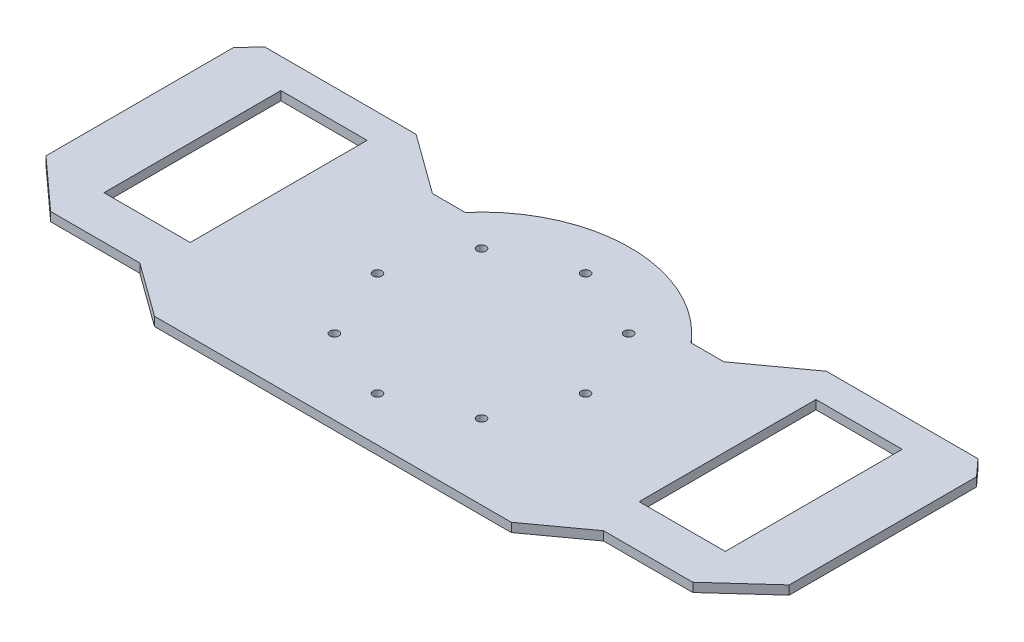
ISO-10303-21;
HEADER;
FILE_DESCRIPTION(('STEP AP214'),'2;1');
FILE_NAME('part.step','',(''),(''),'','','');
FILE_SCHEMA(('AUTOMOTIVE_DESIGN { 1 0 10303 214 1 1 1 1 }'));
ENDSEC;
DATA;
#1=APPLICATION_CONTEXT('core data for automotive mechanical design processes');
#2=APPLICATION_PROTOCOL_DEFINITION('international standard','automotive_design',2000,#1);
#3=PRODUCT_CONTEXT('',#1,'mechanical');
#4=PRODUCT('Part','Part','',(#3));
#5=PRODUCT_RELATED_PRODUCT_CATEGORY('part','',(#4));
#6=PRODUCT_DEFINITION_FORMATION('','',#4);
#7=PRODUCT_DEFINITION_CONTEXT('part definition',#1,'design');
#8=PRODUCT_DEFINITION('design','',#6,#7);
#9=PRODUCT_DEFINITION_SHAPE('','',#8);
#10=(LENGTH_UNIT() NAMED_UNIT(*) SI_UNIT(.MILLI.,.METRE.));
#11=(NAMED_UNIT(*) PLANE_ANGLE_UNIT() SI_UNIT($,.RADIAN.));
#12=(NAMED_UNIT(*) SI_UNIT($,.STERADIAN.) SOLID_ANGLE_UNIT());
#13=UNCERTAINTY_MEASURE_WITH_UNIT(LENGTH_MEASURE(1.E-05),#10,'distance_accuracy_value','');
#14=(GEOMETRIC_REPRESENTATION_CONTEXT(3) GLOBAL_UNCERTAINTY_ASSIGNED_CONTEXT((#13)) GLOBAL_UNIT_ASSIGNED_CONTEXT((#10,
#11,#12)) REPRESENTATION_CONTEXT('',''));
#15=CARTESIAN_POINT('',(0.,0.,0.));
#16=DIRECTION('',(0.,0.,1.));
#17=DIRECTION('',(1.,0.,0.));
#18=AXIS2_PLACEMENT_3D('',#15,#16,#17);
#19=CARTESIAN_POINT('',(0.,3.,-4.99999999999999));
#20=DIRECTION('',(0.,1.,0.));
#21=DIRECTION('',(0.,0.,1.));
#22=AXIS2_PLACEMENT_3D('',#19,#20,#21);
#23=PLANE('',#22);
#24=CARTESIAN_POINT('',(-3.66894015169095E-13,3.,-40.));
#25=DIRECTION('',(0.,1.,0.));
#26=DIRECTION('',(0.,0.,1.));
#27=AXIS2_PLACEMENT_3D('',#24,#25,#26);
#28=CIRCLE('',#27,1.50000000000001);
#29=CARTESIAN_POINT('',(-3.66894015169095E-13,3.,-38.5));
#30=VERTEX_POINT('',#29);
#31=EDGE_CURVE('E824',#30,#30,#28,.T.);
#32=ORIENTED_EDGE('',*,*,#31,.F.);
#33=EDGE_LOOP('',(#32));
#34=FACE_BOUND('',#33,.T.);
#35=CARTESIAN_POINT('',(35.,3.,-5.00000000000024));
#36=DIRECTION('',(0.,1.,0.));
#37=DIRECTION('',(0.,0.,1.));
#38=AXIS2_PLACEMENT_3D('',#35,#36,#37);
#39=CIRCLE('',#38,1.50000000000001);
#40=CARTESIAN_POINT('',(35.,3.,-3.50000000000023));
#41=VERTEX_POINT('',#40);
#42=EDGE_CURVE('E836',#41,#41,#39,.T.);
#43=ORIENTED_EDGE('',*,*,#42,.F.);
#44=EDGE_LOOP('',(#43));
#45=FACE_BOUND('',#44,.T.);
#46=CARTESIAN_POINT('',(1.22298005056365E-13,3.,30.));
#47=DIRECTION('',(0.,1.,0.));
#48=DIRECTION('',(0.,0.,1.));
#49=AXIS2_PLACEMENT_3D('',#46,#47,#48);
#50=CIRCLE('',#49,1.50000000000001);
#51=CARTESIAN_POINT('',(1.22298005056365E-13,3.,31.5));
#52=VERTEX_POINT('',#51);
#53=EDGE_CURVE('E848',#52,#52,#50,.T.);
#54=ORIENTED_EDGE('',*,*,#53,.F.);
#55=EDGE_LOOP('',(#54));
#56=FACE_BOUND('',#55,.T.);
#57=DIRECTION('',(1.,0.,0.));
#58=VECTOR('',#57,1.);
#59=CARTESIAN_POINT('',(-104.5,3.,17.5));
#60=LINE('',#59,#58);
#61=CARTESIAN_POINT('',(-104.5,3.,17.5));
#62=VERTEX_POINT('',#61);
#63=CARTESIAN_POINT('',(-75.5,3.,17.5));
#64=VERTEX_POINT('',#63);
#65=EDGE_CURVE('E214',#62,#64,#60,.T.);
#66=ORIENTED_EDGE('',*,*,#65,.F.);
#67=DIRECTION('',(0.,0.,1.));
#68=VECTOR('',#67,1.);
#69=CARTESIAN_POINT('',(-104.5,3.,-42.));
#70=LINE('',#69,#68);
#71=CARTESIAN_POINT('',(-104.5,3.,-42.));
#72=VERTEX_POINT('',#71);
#73=EDGE_CURVE('E206',#72,#62,#70,.T.);
#74=ORIENTED_EDGE('',*,*,#73,.F.);
#75=DIRECTION('',(-1.,0.,0.));
#76=VECTOR('',#75,1.);
#77=CARTESIAN_POINT('',(-104.5,3.,-42.));
#78=LINE('',#77,#76);
#79=CARTESIAN_POINT('',(-75.5,3.,-42.));
#80=VERTEX_POINT('',#79);
#81=EDGE_CURVE('E229',#80,#72,#78,.T.);
#82=ORIENTED_EDGE('',*,*,#81,.F.);
#83=DIRECTION('',(0.,0.,-1.));
#84=VECTOR('',#83,1.);
#85=CARTESIAN_POINT('',(-75.5,3.,-42.));
#86=LINE('',#85,#84);
#87=EDGE_CURVE('E227',#64,#80,#86,.T.);
#88=ORIENTED_EDGE('',*,*,#87,.F.);
#89=EDGE_LOOP('',(#66,#74,#82,#88));
#90=FACE_BOUND('',#89,.T.);
#91=DIRECTION('',(1.,0.,0.));
#92=VECTOR('',#91,1.);
#93=CARTESIAN_POINT('',(75.5,3.,17.5));
#94=LINE('',#93,#92);
#95=CARTESIAN_POINT('',(75.5,3.,17.5));
#96=VERTEX_POINT('',#95);
#97=CARTESIAN_POINT('',(104.5,3.,17.5));
#98=VERTEX_POINT('',#97);
#99=EDGE_CURVE('E247',#96,#98,#94,.T.);
#100=ORIENTED_EDGE('',*,*,#99,.F.);
#101=DIRECTION('',(0.,0.,1.));
#102=VECTOR('',#101,1.);
#103=CARTESIAN_POINT('',(75.5,3.,-42.));
#104=LINE('',#103,#102);
#105=CARTESIAN_POINT('',(75.5,3.,-42.));
#106=VERTEX_POINT('',#105);
#107=EDGE_CURVE('E245',#106,#96,#104,.T.);
#108=ORIENTED_EDGE('',*,*,#107,.F.);
#109=DIRECTION('',(-1.,0.,0.));
#110=VECTOR('',#109,1.);
#111=CARTESIAN_POINT('',(75.5,3.,-42.));
#112=LINE('',#111,#110);
#113=CARTESIAN_POINT('',(104.5,3.,-42.));
#114=VERTEX_POINT('',#113);
#115=EDGE_CURVE('E253',#114,#106,#112,.T.);
#116=ORIENTED_EDGE('',*,*,#115,.F.);
#117=DIRECTION('',(0.,0.,-1.));
#118=VECTOR('',#117,1.);
#119=CARTESIAN_POINT('',(104.5,3.,-42.));
#120=LINE('',#119,#118);
#121=EDGE_CURVE('E250',#98,#114,#120,.T.);
#122=ORIENTED_EDGE('',*,*,#121,.F.);
#123=EDGE_LOOP('',(#100,#108,#116,#122));
#124=FACE_BOUND('',#123,.T.);
#125=CARTESIAN_POINT('',(-35.,3.,-4.99999999999999));
#126=DIRECTION('',(0.,1.,0.));
#127=DIRECTION('',(0.,0.,1.));
#128=AXIS2_PLACEMENT_3D('',#125,#126,#127);
#129=CIRCLE('',#128,1.5);
#130=CARTESIAN_POINT('',(-35.,3.,-3.49999999999999));
#131=VERTEX_POINT('',#130);
#132=EDGE_CURVE('E276',#131,#131,#129,.T.);
#133=ORIENTED_EDGE('',*,*,#132,.F.);
#134=EDGE_LOOP('',(#133));
#135=FACE_BOUND('',#134,.T.);
#136=DIRECTION('',(-0.809536451060492,0.,-0.587069616318528));
#137=VECTOR('',#136,1.);
#138=CARTESIAN_POINT('',(-69.,3.,-52.));
#139=LINE('',#138,#137);
#140=CARTESIAN_POINT('',(-49.,3.,-37.4961536185439));
#141=VERTEX_POINT('',#140);
#142=CARTESIAN_POINT('',(-69.,3.,-52.));
#143=VERTEX_POINT('',#142);
#144=EDGE_CURVE('E282',#141,#143,#139,.T.);
#145=ORIENTED_EDGE('',*,*,#144,.T.);
#146=DIRECTION('',(-1.,0.,0.));
#147=VECTOR('',#146,1.);
#148=CARTESIAN_POINT('',(-120.,3.,-52.));
#149=LINE('',#148,#147);
#150=CARTESIAN_POINT('',(-120.,3.,-52.));
#151=VERTEX_POINT('',#150);
#152=EDGE_CURVE('E285',#143,#151,#149,.T.);
#153=ORIENTED_EDGE('',*,*,#152,.T.);
#154=DIRECTION('',(-0.672376251725183,0.,0.740209548787364));
#155=VECTOR('',#154,1.);
#156=CARTESIAN_POINT('',(-125.,3.,-46.4955703976149));
#157=LINE('',#156,#155);
#158=CARTESIAN_POINT('',(-125.,3.,-46.4955703976149));
#159=VERTEX_POINT('',#158);
#160=EDGE_CURVE('E288',#151,#159,#157,.T.);
#161=ORIENTED_EDGE('',*,*,#160,.T.);
#162=DIRECTION('',(0.,0.,1.));
#163=VECTOR('',#162,1.);
#164=CARTESIAN_POINT('',(-125.,3.,16.5044296023851));
#165=LINE('',#164,#163);
#166=CARTESIAN_POINT('',(-125.,3.,16.5044296023851));
#167=VERTEX_POINT('',#166);
#168=EDGE_CURVE('E290',#159,#167,#165,.T.);
#169=ORIENTED_EDGE('',*,*,#168,.T.);
#170=DIRECTION('',(0.740209548787364,0.,0.672376251725183));
#171=VECTOR('',#170,1.);
#172=CARTESIAN_POINT('',(-108.,3.,31.9465382566895));
#173=LINE('',#172,#171);
#174=CARTESIAN_POINT('',(-108.,3.,31.9465382566895));
#175=VERTEX_POINT('',#174);
#176=EDGE_CURVE('E292',#167,#175,#173,.T.);
#177=ORIENTED_EDGE('',*,*,#176,.T.);
#178=DIRECTION('',(1.,0.,0.));
#179=VECTOR('',#178,1.);
#180=CARTESIAN_POINT('',(-78.,3.,31.9465382566895));
#181=LINE('',#180,#179);
#182=CARTESIAN_POINT('',(-78.,3.,31.9465382566895));
#183=VERTEX_POINT('',#182);
#184=EDGE_CURVE('E294',#175,#183,#181,.T.);
#185=ORIENTED_EDGE('',*,*,#184,.T.);
#186=DIRECTION('',(0.809536451060491,0.,0.587069616318529));
#187=VECTOR('',#186,1.);
#188=CARTESIAN_POINT('',(-60.,3.,45.));
#189=LINE('',#188,#187);
#190=CARTESIAN_POINT('',(-60.,3.,45.));
#191=VERTEX_POINT('',#190);
#192=EDGE_CURVE('E296',#183,#191,#189,.T.);
#193=ORIENTED_EDGE('',*,*,#192,.T.);
#194=DIRECTION('',(1.,0.,0.));
#195=VECTOR('',#194,1.);
#196=CARTESIAN_POINT('',(60.,3.,45.));
#197=LINE('',#196,#195);
#198=CARTESIAN_POINT('',(60.,3.,45.));
#199=VERTEX_POINT('',#198);
#200=EDGE_CURVE('E298',#191,#199,#197,.T.);
#201=ORIENTED_EDGE('',*,*,#200,.T.);
#202=DIRECTION('',(0.809536451060491,0.,-0.587069616318529));
#203=VECTOR('',#202,1.);
#204=CARTESIAN_POINT('',(78.,3.,31.9465382566895));
#205=LINE('',#204,#203);
#206=CARTESIAN_POINT('',(78.,3.,31.9465382566895));
#207=VERTEX_POINT('',#206);
#208=EDGE_CURVE('E300',#199,#207,#205,.T.);
#209=ORIENTED_EDGE('',*,*,#208,.T.);
#210=DIRECTION('',(1.,0.,0.));
#211=VECTOR('',#210,1.);
#212=CARTESIAN_POINT('',(108.,3.,31.9465382566895));
#213=LINE('',#212,#211);
#214=CARTESIAN_POINT('',(108.,3.,31.9465382566895));
#215=VERTEX_POINT('',#214);
#216=EDGE_CURVE('E302',#207,#215,#213,.T.);
#217=ORIENTED_EDGE('',*,*,#216,.T.);
#218=DIRECTION('',(0.740209548787364,0.,-0.672376251725183));
#219=VECTOR('',#218,1.);
#220=CARTESIAN_POINT('',(125.,3.,16.5044296023851));
#221=LINE('',#220,#219);
#222=CARTESIAN_POINT('',(125.,3.,16.5044296023851));
#223=VERTEX_POINT('',#222);
#224=EDGE_CURVE('E304',#215,#223,#221,.T.);
#225=ORIENTED_EDGE('',*,*,#224,.T.);
#226=DIRECTION('',(0.,0.,-1.));
#227=VECTOR('',#226,1.);
#228=CARTESIAN_POINT('',(125.,3.,-46.4955703976149));
#229=LINE('',#228,#227);
#230=CARTESIAN_POINT('',(125.,3.,-46.4955703976149));
#231=VERTEX_POINT('',#230);
#232=EDGE_CURVE('E306',#223,#231,#229,.T.);
#233=ORIENTED_EDGE('',*,*,#232,.T.);
#234=DIRECTION('',(-0.672376251725188,0.,-0.740209548787359));
#235=VECTOR('',#234,1.);
#236=CARTESIAN_POINT('',(125.,3.,-46.4955703976149));
#237=LINE('',#236,#235);
#238=CARTESIAN_POINT('',(120.,3.,-52.));
#239=VERTEX_POINT('',#238);
#240=EDGE_CURVE('E308',#231,#239,#237,.T.);
#241=ORIENTED_EDGE('',*,*,#240,.T.);
#242=DIRECTION('',(-1.,0.,0.));
#243=VECTOR('',#242,1.);
#244=CARTESIAN_POINT('',(120.,3.,-52.));
#245=LINE('',#244,#243);
#246=CARTESIAN_POINT('',(69.,3.,-52.));
#247=VERTEX_POINT('',#246);
#248=EDGE_CURVE('E310',#239,#247,#245,.T.);
#249=ORIENTED_EDGE('',*,*,#248,.T.);
#250=DIRECTION('',(-0.809536451060492,0.,0.587069616318528));
#251=VECTOR('',#250,1.);
#252=CARTESIAN_POINT('',(69.,3.,-52.));
#253=LINE('',#252,#251);
#254=CARTESIAN_POINT('',(49.,3.,-37.4961536185438));
#255=VERTEX_POINT('',#254);
#256=EDGE_CURVE('E312',#247,#255,#253,.T.);
#257=ORIENTED_EDGE('',*,*,#256,.T.);
#258=DIRECTION('',(-1.,0.,0.));
#259=VECTOR('',#258,1.);
#260=CARTESIAN_POINT('',(49.,3.,-37.4961536185438));
#261=LINE('',#260,#259);
#262=CARTESIAN_POINT('',(38.,3.,-37.4961536185438));
#263=VERTEX_POINT('',#262);
#264=EDGE_CURVE('E314',#255,#263,#261,.T.);
#265=ORIENTED_EDGE('',*,*,#264,.T.);
#266=CARTESIAN_POINT('',(0.,3.,-4.99999999999999));
#267=DIRECTION('',(0.,1.,0.));
#268=DIRECTION('',(0.,0.,1.));
#269=AXIS2_PLACEMENT_3D('',#266,#267,#268);
#270=CIRCLE('',#269,50.);
#271=CARTESIAN_POINT('',(-38.,3.,-37.4961536185439));
#272=VERTEX_POINT('',#271);
#273=EDGE_CURVE('E316',#263,#272,#270,.T.);
#274=ORIENTED_EDGE('',*,*,#273,.T.);
#275=DIRECTION('',(-1.,0.,0.));
#276=VECTOR('',#275,1.);
#277=CARTESIAN_POINT('',(-49.,3.,-37.4961536185439));
#278=LINE('',#277,#276);
#279=EDGE_CURVE('E318',#272,#141,#278,.T.);
#280=ORIENTED_EDGE('',*,*,#279,.T.);
#281=EDGE_LOOP('',(#145,#153,#161,#169,#177,#185,#193,#201,#209,#217,#225,#233,#241,#249,#257,
#265,#274,#280));
#282=FACE_BOUND('',#281,.T.);
#283=CARTESIAN_POINT('',(-24.7487373415291,3.,19.7487373415292));
#284=DIRECTION('',(0.,1.,0.));
#285=DIRECTION('',(0.,0.,1.));
#286=AXIS2_PLACEMENT_3D('',#283,#284,#285);
#287=CIRCLE('',#286,1.50000000000001);
#288=CARTESIAN_POINT('',(-24.7487373415291,3.,21.2487373415292));
#289=VERTEX_POINT('',#288);
#290=EDGE_CURVE('E235',#289,#289,#287,.T.);
#291=ORIENTED_EDGE('',*,*,#290,.F.);
#292=EDGE_LOOP('',(#291));
#293=FACE_BOUND('',#292,.T.);
#294=CARTESIAN_POINT('',(24.7487373415293,3.,19.7487373415291));
#295=DIRECTION('',(0.,1.,0.));
#296=DIRECTION('',(0.,0.,1.));
#297=AXIS2_PLACEMENT_3D('',#294,#295,#296);
#298=CIRCLE('',#297,1.50000000000001);
#299=CARTESIAN_POINT('',(24.7487373415293,3.,21.2487373415291));
#300=VERTEX_POINT('',#299);
#301=EDGE_CURVE('E842',#300,#300,#298,.T.);
#302=ORIENTED_EDGE('',*,*,#301,.F.);
#303=EDGE_LOOP('',(#302));
#304=FACE_BOUND('',#303,.T.);
#305=CARTESIAN_POINT('',(24.748737341529,3.,-29.7487373415294));
#306=DIRECTION('',(0.,1.,0.));
#307=DIRECTION('',(0.,0.,1.));
#308=AXIS2_PLACEMENT_3D('',#305,#306,#307);
#309=CIRCLE('',#308,1.5);
#310=CARTESIAN_POINT('',(24.748737341529,3.,-28.2487373415294));
#311=VERTEX_POINT('',#310);
#312=EDGE_CURVE('E830',#311,#311,#309,.T.);
#313=ORIENTED_EDGE('',*,*,#312,.F.);
#314=EDGE_LOOP('',(#313));
#315=FACE_BOUND('',#314,.T.);
#316=CARTESIAN_POINT('',(-24.7487373415295,3.,-29.7487373415289));
#317=DIRECTION('',(0.,1.,0.));
#318=DIRECTION('',(0.,0.,1.));
#319=AXIS2_PLACEMENT_3D('',#316,#317,#318);
#320=CIRCLE('',#319,1.5);
#321=CARTESIAN_POINT('',(-24.7487373415295,3.,-28.2487373415288));
#322=VERTEX_POINT('',#321);
#323=EDGE_CURVE('E815',#322,#322,#320,.T.);
#324=ORIENTED_EDGE('',*,*,#323,.F.);
#325=EDGE_LOOP('',(#324));
#326=FACE_BOUND('',#325,.T.);
#327=ADVANCED_FACE('F33',(#34,#45,#56,#90,#124,#135,#282,#293,#304,#315,#326),#23,.T.);
#328=CARTESIAN_POINT('',(0.,0.,-4.99999999999999));
#329=DIRECTION('',(0.,1.,0.));
#330=DIRECTION('',(0.,0.,1.));
#331=AXIS2_PLACEMENT_3D('',#328,#329,#330);
#332=PLANE('',#331);
#333=DIRECTION('',(0.,0.,1.));
#334=VECTOR('',#333,1.);
#335=CARTESIAN_POINT('',(75.5,0.,-42.));
#336=LINE('',#335,#334);
#337=CARTESIAN_POINT('',(75.5,0.,-42.));
#338=VERTEX_POINT('',#337);
#339=CARTESIAN_POINT('',(75.5,0.,17.5));
#340=VERTEX_POINT('',#339);
#341=EDGE_CURVE('E222',#338,#340,#336,.T.);
#342=ORIENTED_EDGE('',*,*,#341,.T.);
#343=DIRECTION('',(1.,0.,0.));
#344=VECTOR('',#343,1.);
#345=CARTESIAN_POINT('',(75.5,0.,17.5));
#346=LINE('',#345,#344);
#347=CARTESIAN_POINT('',(104.5,0.,17.5));
#348=VERTEX_POINT('',#347);
#349=EDGE_CURVE('E258',#340,#348,#346,.T.);
#350=ORIENTED_EDGE('',*,*,#349,.T.);
#351=DIRECTION('',(0.,0.,-1.));
#352=VECTOR('',#351,1.);
#353=CARTESIAN_POINT('',(104.5,0.,-42.));
#354=LINE('',#353,#352);
#355=CARTESIAN_POINT('',(104.5,0.,-42.));
#356=VERTEX_POINT('',#355);
#357=EDGE_CURVE('E261',#348,#356,#354,.T.);
#358=ORIENTED_EDGE('',*,*,#357,.T.);
#359=DIRECTION('',(-1.,0.,0.));
#360=VECTOR('',#359,1.);
#361=CARTESIAN_POINT('',(75.5,0.,-42.));
#362=LINE('',#361,#360);
#363=EDGE_CURVE('E248',#356,#338,#362,.T.);
#364=ORIENTED_EDGE('',*,*,#363,.T.);
#365=EDGE_LOOP('',(#342,#350,#358,#364));
#366=FACE_BOUND('',#365,.T.);
#367=DIRECTION('',(-0.809536451060492,0.,-0.587069616318528));
#368=VECTOR('',#367,1.);
#369=CARTESIAN_POINT('',(-69.,0.,-52.));
#370=LINE('',#369,#368);
#371=CARTESIAN_POINT('',(-49.,0.,-37.4961536185439));
#372=VERTEX_POINT('',#371);
#373=CARTESIAN_POINT('',(-69.,0.,-52.));
#374=VERTEX_POINT('',#373);
#375=EDGE_CURVE('E279',#372,#374,#370,.T.);
#376=ORIENTED_EDGE('',*,*,#375,.F.);
#377=DIRECTION('',(-1.,0.,0.));
#378=VECTOR('',#377,1.);
#379=CARTESIAN_POINT('',(-49.,0.,-37.4961536185439));
#380=LINE('',#379,#378);
#381=CARTESIAN_POINT('',(-38.,0.,-37.4961536185439));
#382=VERTEX_POINT('',#381);
#383=EDGE_CURVE('E286',#382,#372,#380,.T.);
#384=ORIENTED_EDGE('',*,*,#383,.F.);
#385=CARTESIAN_POINT('',(0.,0.,-4.99999999999999));
#386=DIRECTION('',(0.,1.,0.));
#387=DIRECTION('',(0.,0.,1.));
#388=AXIS2_PLACEMENT_3D('',#385,#386,#387);
#389=CIRCLE('',#388,50.);
#390=CARTESIAN_POINT('',(38.,0.,-37.4961536185438));
#391=VERTEX_POINT('',#390);
#392=EDGE_CURVE('E353',#391,#382,#389,.T.);
#393=ORIENTED_EDGE('',*,*,#392,.F.);
#394=DIRECTION('',(-1.,0.,0.));
#395=VECTOR('',#394,1.);
#396=CARTESIAN_POINT('',(49.,0.,-37.4961536185438));
#397=LINE('',#396,#395);
#398=CARTESIAN_POINT('',(49.,0.,-37.4961536185438));
#399=VERTEX_POINT('',#398);
#400=EDGE_CURVE('E351',#399,#391,#397,.T.);
#401=ORIENTED_EDGE('',*,*,#400,.F.);
#402=DIRECTION('',(-0.809536451060492,0.,0.587069616318528));
#403=VECTOR('',#402,1.);
#404=CARTESIAN_POINT('',(69.,0.,-52.));
#405=LINE('',#404,#403);
#406=CARTESIAN_POINT('',(69.,0.,-52.));
#407=VERTEX_POINT('',#406);
#408=EDGE_CURVE('E349',#407,#399,#405,.T.);
#409=ORIENTED_EDGE('',*,*,#408,.F.);
#410=DIRECTION('',(-1.,0.,0.));
#411=VECTOR('',#410,1.);
#412=CARTESIAN_POINT('',(120.,0.,-52.));
#413=LINE('',#412,#411);
#414=CARTESIAN_POINT('',(120.,0.,-52.));
#415=VERTEX_POINT('',#414);
#416=EDGE_CURVE('E347',#415,#407,#413,.T.);
#417=ORIENTED_EDGE('',*,*,#416,.F.);
#418=DIRECTION('',(-0.672376251725188,0.,-0.740209548787359));
#419=VECTOR('',#418,1.);
#420=CARTESIAN_POINT('',(125.,0.,-46.4955703976149));
#421=LINE('',#420,#419);
#422=CARTESIAN_POINT('',(125.,0.,-46.4955703976149));
#423=VERTEX_POINT('',#422);
#424=EDGE_CURVE('E345',#423,#415,#421,.T.);
#425=ORIENTED_EDGE('',*,*,#424,.F.);
#426=DIRECTION('',(0.,0.,-1.));
#427=VECTOR('',#426,1.);
#428=CARTESIAN_POINT('',(125.,0.,-46.4955703976149));
#429=LINE('',#428,#427);
#430=CARTESIAN_POINT('',(125.,0.,16.5044296023851));
#431=VERTEX_POINT('',#430);
#432=EDGE_CURVE('E343',#431,#423,#429,.T.);
#433=ORIENTED_EDGE('',*,*,#432,.F.);
#434=DIRECTION('',(0.740209548787364,0.,-0.672376251725183));
#435=VECTOR('',#434,1.);
#436=CARTESIAN_POINT('',(125.,0.,16.5044296023851));
#437=LINE('',#436,#435);
#438=CARTESIAN_POINT('',(108.,0.,31.9465382566895));
#439=VERTEX_POINT('',#438);
#440=EDGE_CURVE('E341',#439,#431,#437,.T.);
#441=ORIENTED_EDGE('',*,*,#440,.F.);
#442=DIRECTION('',(1.,0.,0.));
#443=VECTOR('',#442,1.);
#444=CARTESIAN_POINT('',(108.,0.,31.9465382566895));
#445=LINE('',#444,#443);
#446=CARTESIAN_POINT('',(78.,0.,31.9465382566895));
#447=VERTEX_POINT('',#446);
#448=EDGE_CURVE('E339',#447,#439,#445,.T.);
#449=ORIENTED_EDGE('',*,*,#448,.F.);
#450=DIRECTION('',(0.809536451060491,0.,-0.587069616318529));
#451=VECTOR('',#450,1.);
#452=CARTESIAN_POINT('',(78.,0.,31.9465382566895));
#453=LINE('',#452,#451);
#454=CARTESIAN_POINT('',(60.,0.,45.));
#455=VERTEX_POINT('',#454);
#456=EDGE_CURVE('E337',#455,#447,#453,.T.);
#457=ORIENTED_EDGE('',*,*,#456,.F.);
#458=DIRECTION('',(1.,0.,0.));
#459=VECTOR('',#458,1.);
#460=CARTESIAN_POINT('',(60.,0.,45.));
#461=LINE('',#460,#459);
#462=CARTESIAN_POINT('',(-60.,0.,45.));
#463=VERTEX_POINT('',#462);
#464=EDGE_CURVE('E335',#463,#455,#461,.T.);
#465=ORIENTED_EDGE('',*,*,#464,.F.);
#466=DIRECTION('',(0.809536451060491,0.,0.587069616318529));
#467=VECTOR('',#466,1.);
#468=CARTESIAN_POINT('',(-60.,0.,45.));
#469=LINE('',#468,#467);
#470=CARTESIAN_POINT('',(-78.,0.,31.9465382566895));
#471=VERTEX_POINT('',#470);
#472=EDGE_CURVE('E333',#471,#463,#469,.T.);
#473=ORIENTED_EDGE('',*,*,#472,.F.);
#474=DIRECTION('',(1.,0.,0.));
#475=VECTOR('',#474,1.);
#476=CARTESIAN_POINT('',(-78.,0.,31.9465382566895));
#477=LINE('',#476,#475);
#478=CARTESIAN_POINT('',(-108.,0.,31.9465382566895));
#479=VERTEX_POINT('',#478);
#480=EDGE_CURVE('E331',#479,#471,#477,.T.);
#481=ORIENTED_EDGE('',*,*,#480,.F.);
#482=DIRECTION('',(0.740209548787364,0.,0.672376251725183));
#483=VECTOR('',#482,1.);
#484=CARTESIAN_POINT('',(-108.,0.,31.9465382566895));
#485=LINE('',#484,#483);
#486=CARTESIAN_POINT('',(-125.,0.,16.5044296023851));
#487=VERTEX_POINT('',#486);
#488=EDGE_CURVE('E329',#487,#479,#485,.T.);
#489=ORIENTED_EDGE('',*,*,#488,.F.);
#490=DIRECTION('',(0.,0.,1.));
#491=VECTOR('',#490,1.);
#492=CARTESIAN_POINT('',(-125.,0.,16.5044296023851));
#493=LINE('',#492,#491);
#494=CARTESIAN_POINT('',(-125.,0.,-46.4955703976149));
#495=VERTEX_POINT('',#494);
#496=EDGE_CURVE('E327',#495,#487,#493,.T.);
#497=ORIENTED_EDGE('',*,*,#496,.F.);
#498=DIRECTION('',(-0.672376251725183,0.,0.740209548787364));
#499=VECTOR('',#498,1.);
#500=CARTESIAN_POINT('',(-125.,0.,-46.4955703976149));
#501=LINE('',#500,#499);
#502=CARTESIAN_POINT('',(-120.,0.,-52.));
#503=VERTEX_POINT('',#502);
#504=EDGE_CURVE('E325',#503,#495,#501,.T.);
#505=ORIENTED_EDGE('',*,*,#504,.F.);
#506=DIRECTION('',(-1.,0.,0.));
#507=VECTOR('',#506,1.);
#508=CARTESIAN_POINT('',(-120.,0.,-52.));
#509=LINE('',#508,#507);
#510=EDGE_CURVE('E323',#374,#503,#509,.T.);
#511=ORIENTED_EDGE('',*,*,#510,.F.);
#512=EDGE_LOOP('',(#376,#384,#393,#401,#409,#417,#425,#433,#441,#449,#457,#465,#473,#481,#489,
#497,#505,#511));
#513=FACE_BOUND('',#512,.T.);
#514=CARTESIAN_POINT('',(-35.,0.,-4.99999999999999));
#515=DIRECTION('',(0.,1.,0.));
#516=DIRECTION('',(0.,0.,1.));
#517=AXIS2_PLACEMENT_3D('',#514,#515,#516);
#518=CIRCLE('',#517,1.5);
#519=CARTESIAN_POINT('',(-35.,0.,-3.49999999999999));
#520=VERTEX_POINT('',#519);
#521=EDGE_CURVE('E275',#520,#520,#518,.T.);
#522=ORIENTED_EDGE('',*,*,#521,.T.);
#523=EDGE_LOOP('',(#522));
#524=FACE_BOUND('',#523,.T.);
#525=DIRECTION('',(0.,0.,1.));
#526=VECTOR('',#525,1.);
#527=CARTESIAN_POINT('',(-104.5,0.,-42.));
#528=LINE('',#527,#526);
#529=CARTESIAN_POINT('',(-104.5,0.,-42.));
#530=VERTEX_POINT('',#529);
#531=CARTESIAN_POINT('',(-104.5,0.,17.5));
#532=VERTEX_POINT('',#531);
#533=EDGE_CURVE('E56',#530,#532,#528,.T.);
#534=ORIENTED_EDGE('',*,*,#533,.T.);
#535=DIRECTION('',(1.,0.,0.));
#536=VECTOR('',#535,1.);
#537=CARTESIAN_POINT('',(-104.5,0.,17.5));
#538=LINE('',#537,#536);
#539=CARTESIAN_POINT('',(-75.5,0.,17.5));
#540=VERTEX_POINT('',#539);
#541=EDGE_CURVE('E221',#532,#540,#538,.T.);
#542=ORIENTED_EDGE('',*,*,#541,.T.);
#543=DIRECTION('',(0.,0.,-1.));
#544=VECTOR('',#543,1.);
#545=CARTESIAN_POINT('',(-75.5,0.,-42.));
#546=LINE('',#545,#544);
#547=CARTESIAN_POINT('',(-75.5,0.,-42.));
#548=VERTEX_POINT('',#547);
#549=EDGE_CURVE('E237',#540,#548,#546,.T.);
#550=ORIENTED_EDGE('',*,*,#549,.T.);
#551=DIRECTION('',(-1.,0.,0.));
#552=VECTOR('',#551,1.);
#553=CARTESIAN_POINT('',(-104.5,0.,-42.));
#554=LINE('',#553,#552);
#555=EDGE_CURVE('E215',#548,#530,#554,.T.);
#556=ORIENTED_EDGE('',*,*,#555,.T.);
#557=EDGE_LOOP('',(#534,#542,#550,#556));
#558=FACE_BOUND('',#557,.T.);
#559=CARTESIAN_POINT('',(-24.7487373415291,0.,19.7487373415292));
#560=DIRECTION('',(0.,1.,0.));
#561=DIRECTION('',(0.,0.,1.));
#562=AXIS2_PLACEMENT_3D('',#559,#560,#561);
#563=CIRCLE('',#562,1.50000000000001);
#564=CARTESIAN_POINT('',(-24.7487373415291,0.,21.2487373415292));
#565=VERTEX_POINT('',#564);
#566=EDGE_CURVE('E851',#565,#565,#563,.T.);
#567=ORIENTED_EDGE('',*,*,#566,.T.);
#568=EDGE_LOOP('',(#567));
#569=FACE_BOUND('',#568,.T.);
#570=CARTESIAN_POINT('',(1.22298005056365E-13,0.,30.));
#571=DIRECTION('',(0.,1.,0.));
#572=DIRECTION('',(0.,0.,1.));
#573=AXIS2_PLACEMENT_3D('',#570,#571,#572);
#574=CIRCLE('',#573,1.50000000000001);
#575=CARTESIAN_POINT('',(1.22298005056365E-13,0.,31.5));
#576=VERTEX_POINT('',#575);
#577=EDGE_CURVE('E845',#576,#576,#574,.T.);
#578=ORIENTED_EDGE('',*,*,#577,.T.);
#579=EDGE_LOOP('',(#578));
#580=FACE_BOUND('',#579,.T.);
#581=CARTESIAN_POINT('',(24.7487373415293,0.,19.7487373415291));
#582=DIRECTION('',(0.,1.,0.));
#583=DIRECTION('',(0.,0.,1.));
#584=AXIS2_PLACEMENT_3D('',#581,#582,#583);
#585=CIRCLE('',#584,1.50000000000001);
#586=CARTESIAN_POINT('',(24.7487373415293,0.,21.2487373415291));
#587=VERTEX_POINT('',#586);
#588=EDGE_CURVE('E839',#587,#587,#585,.T.);
#589=ORIENTED_EDGE('',*,*,#588,.T.);
#590=EDGE_LOOP('',(#589));
#591=FACE_BOUND('',#590,.T.);
#592=CARTESIAN_POINT('',(35.,0.,-5.00000000000024));
#593=DIRECTION('',(0.,1.,0.));
#594=DIRECTION('',(0.,0.,1.));
#595=AXIS2_PLACEMENT_3D('',#592,#593,#594);
#596=CIRCLE('',#595,1.50000000000001);
#597=CARTESIAN_POINT('',(35.,0.,-3.50000000000023));
#598=VERTEX_POINT('',#597);
#599=EDGE_CURVE('E833',#598,#598,#596,.T.);
#600=ORIENTED_EDGE('',*,*,#599,.T.);
#601=EDGE_LOOP('',(#600));
#602=FACE_BOUND('',#601,.T.);
#603=CARTESIAN_POINT('',(24.748737341529,0.,-29.7487373415294));
#604=DIRECTION('',(0.,1.,0.));
#605=DIRECTION('',(0.,0.,1.));
#606=AXIS2_PLACEMENT_3D('',#603,#604,#605);
#607=CIRCLE('',#606,1.5);
#608=CARTESIAN_POINT('',(24.748737341529,0.,-28.2487373415294));
#609=VERTEX_POINT('',#608);
#610=EDGE_CURVE('E827',#609,#609,#607,.T.);
#611=ORIENTED_EDGE('',*,*,#610,.T.);
#612=EDGE_LOOP('',(#611));
#613=FACE_BOUND('',#612,.T.);
#614=CARTESIAN_POINT('',(-3.66894015169095E-13,0.,-40.));
#615=DIRECTION('',(0.,1.,0.));
#616=DIRECTION('',(0.,0.,1.));
#617=AXIS2_PLACEMENT_3D('',#614,#615,#616);
#618=CIRCLE('',#617,1.50000000000001);
#619=CARTESIAN_POINT('',(-3.66894015169095E-13,0.,-38.5));
#620=VERTEX_POINT('',#619);
#621=EDGE_CURVE('E821',#620,#620,#618,.T.);
#622=ORIENTED_EDGE('',*,*,#621,.T.);
#623=EDGE_LOOP('',(#622));
#624=FACE_BOUND('',#623,.T.);
#625=CARTESIAN_POINT('',(-24.7487373415295,0.,-29.7487373415289));
#626=DIRECTION('',(0.,1.,0.));
#627=DIRECTION('',(0.,0.,1.));
#628=AXIS2_PLACEMENT_3D('',#625,#626,#627);
#629=CIRCLE('',#628,1.5);
#630=CARTESIAN_POINT('',(-24.7487373415295,0.,-28.2487373415288));
#631=VERTEX_POINT('',#630);
#632=EDGE_CURVE('E818',#631,#631,#629,.T.);
#633=ORIENTED_EDGE('',*,*,#632,.T.);
#634=EDGE_LOOP('',(#633));
#635=FACE_BOUND('',#634,.T.);
#636=ADVANCED_FACE('F413',(#366,#513,#524,#558,#569,#580,#591,#602,#613,#624,#635),#332,.F.);
#637=CARTESIAN_POINT('',(-69.,3.,-52.));
#638=DIRECTION('',(-0.587069616318528,0.,0.809536451060492));
#639=DIRECTION('',(0.809536451060492,0.,0.587069616318529));
#640=AXIS2_PLACEMENT_3D('',#637,#638,#639);
#641=PLANE('',#640);
#642=ORIENTED_EDGE('',*,*,#375,.T.);
#643=DIRECTION('',(0.,-1.,0.));
#644=VECTOR('',#643,1.);
#645=CARTESIAN_POINT('',(-69.,3.,-52.));
#646=LINE('',#645,#644);
#647=EDGE_CURVE('E11',#143,#374,#646,.T.);
#648=ORIENTED_EDGE('',*,*,#647,.F.);
#649=ORIENTED_EDGE('',*,*,#144,.F.);
#650=DIRECTION('',(0.,-1.,0.));
#651=VECTOR('',#650,1.);
#652=CARTESIAN_POINT('',(-49.,3.,-37.4961536185439));
#653=LINE('',#652,#651);
#654=EDGE_CURVE('E320',#141,#372,#653,.T.);
#655=ORIENTED_EDGE('',*,*,#654,.T.);
#656=EDGE_LOOP('',(#642,#648,#649,#655));
#657=FACE_BOUND('',#656,.T.);
#658=ADVANCED_FACE('F35',(#657),#641,.F.);
#659=CARTESIAN_POINT('',(-120.,3.,-52.));
#660=DIRECTION('',(0.,0.,1.));
#661=DIRECTION('',(1.,0.,0.));
#662=AXIS2_PLACEMENT_3D('',#659,#660,#661);
#663=PLANE('',#662);
#664=ORIENTED_EDGE('',*,*,#510,.T.);
#665=DIRECTION('',(0.,-1.,0.));
#666=VECTOR('',#665,1.);
#667=CARTESIAN_POINT('',(-120.,3.,-52.));
#668=LINE('',#667,#666);
#669=EDGE_CURVE('E41',#151,#503,#668,.T.);
#670=ORIENTED_EDGE('',*,*,#669,.F.);
#671=ORIENTED_EDGE('',*,*,#152,.F.);
#672=ORIENTED_EDGE('',*,*,#647,.T.);
#673=EDGE_LOOP('',(#664,#670,#671,#672));
#674=FACE_BOUND('',#673,.T.);
#675=ADVANCED_FACE('F431',(#674),#663,.F.);
#676=CARTESIAN_POINT('',(-125.,3.,-46.4955703976149));
#677=DIRECTION('',(0.740209548787365,0.,0.672376251725183));
#678=DIRECTION('',(0.672376251725183,0.,-0.740209548787365));
#679=AXIS2_PLACEMENT_3D('',#676,#677,#678);
#680=PLANE('',#679);
#681=ORIENTED_EDGE('',*,*,#504,.T.);
#682=DIRECTION('',(0.,-1.,0.));
#683=VECTOR('',#682,1.);
#684=CARTESIAN_POINT('',(-125.,3.,-46.4955703976149));
#685=LINE('',#684,#683);
#686=EDGE_CURVE('E400',#159,#495,#685,.T.);
#687=ORIENTED_EDGE('',*,*,#686,.F.);
#688=ORIENTED_EDGE('',*,*,#160,.F.);
#689=ORIENTED_EDGE('',*,*,#669,.T.);
#690=EDGE_LOOP('',(#681,#687,#688,#689));
#691=FACE_BOUND('',#690,.T.);
#692=ADVANCED_FACE('F407',(#691),#680,.F.);
#693=CARTESIAN_POINT('',(-125.,3.,16.5044296023851));
#694=DIRECTION('',(1.,0.,0.));
#695=DIRECTION('',(0.,0.,-1.));
#696=AXIS2_PLACEMENT_3D('',#693,#694,#695);
#697=PLANE('',#696);
#698=ORIENTED_EDGE('',*,*,#496,.T.);
#699=DIRECTION('',(0.,-1.,0.));
#700=VECTOR('',#699,1.);
#701=CARTESIAN_POINT('',(-125.,3.,16.5044296023851));
#702=LINE('',#701,#700);
#703=EDGE_CURVE('E397',#167,#487,#702,.T.);
#704=ORIENTED_EDGE('',*,*,#703,.F.);
#705=ORIENTED_EDGE('',*,*,#168,.F.);
#706=ORIENTED_EDGE('',*,*,#686,.T.);
#707=EDGE_LOOP('',(#698,#704,#705,#706));
#708=FACE_BOUND('',#707,.T.);
#709=ADVANCED_FACE('F419',(#708),#697,.F.);
#710=CARTESIAN_POINT('',(-108.,3.,31.9465382566895));
#711=DIRECTION('',(0.672376251725183,0.,-0.740209548787364));
#712=DIRECTION('',(-0.740209548787364,0.,-0.672376251725183));
#713=AXIS2_PLACEMENT_3D('',#710,#711,#712);
#714=PLANE('',#713);
#715=ORIENTED_EDGE('',*,*,#488,.T.);
#716=DIRECTION('',(0.,-1.,0.));
#717=VECTOR('',#716,1.);
#718=CARTESIAN_POINT('',(-108.,3.,31.9465382566895));
#719=LINE('',#718,#717);
#720=EDGE_CURVE('E394',#175,#479,#719,.T.);
#721=ORIENTED_EDGE('',*,*,#720,.F.);
#722=ORIENTED_EDGE('',*,*,#176,.F.);
#723=ORIENTED_EDGE('',*,*,#703,.T.);
#724=EDGE_LOOP('',(#715,#721,#722,#723));
#725=FACE_BOUND('',#724,.T.);
#726=ADVANCED_FACE('F423',(#725),#714,.F.);
#727=CARTESIAN_POINT('',(-78.,3.,31.9465382566895));
#728=DIRECTION('',(0.,0.,-1.));
#729=DIRECTION('',(-1.,0.,0.));
#730=AXIS2_PLACEMENT_3D('',#727,#728,#729);
#731=PLANE('',#730);
#732=ORIENTED_EDGE('',*,*,#480,.T.);
#733=DIRECTION('',(0.,-1.,0.));
#734=VECTOR('',#733,1.);
#735=CARTESIAN_POINT('',(-78.,3.,31.9465382566895));
#736=LINE('',#735,#734);
#737=EDGE_CURVE('E391',#183,#471,#736,.T.);
#738=ORIENTED_EDGE('',*,*,#737,.F.);
#739=ORIENTED_EDGE('',*,*,#184,.F.);
#740=ORIENTED_EDGE('',*,*,#720,.T.);
#741=EDGE_LOOP('',(#732,#738,#739,#740));
#742=FACE_BOUND('',#741,.T.);
#743=ADVANCED_FACE('F494',(#742),#731,.F.);
#744=CARTESIAN_POINT('',(-60.,3.,45.));
#745=DIRECTION('',(0.587069616318529,0.,-0.809536451060491));
#746=DIRECTION('',(-0.809536451060491,0.,-0.587069616318529));
#747=AXIS2_PLACEMENT_3D('',#744,#745,#746);
#748=PLANE('',#747);
#749=ORIENTED_EDGE('',*,*,#472,.T.);
#750=DIRECTION('',(0.,-1.,0.));
#751=VECTOR('',#750,1.);
#752=CARTESIAN_POINT('',(-60.,3.,45.));
#753=LINE('',#752,#751);
#754=EDGE_CURVE('E388',#191,#463,#753,.T.);
#755=ORIENTED_EDGE('',*,*,#754,.F.);
#756=ORIENTED_EDGE('',*,*,#192,.F.);
#757=ORIENTED_EDGE('',*,*,#737,.T.);
#758=EDGE_LOOP('',(#749,#755,#756,#757));
#759=FACE_BOUND('',#758,.T.);
#760=ADVANCED_FACE('F492',(#759),#748,.F.);
#761=CARTESIAN_POINT('',(60.,3.,45.));
#762=DIRECTION('',(0.,0.,-1.));
#763=DIRECTION('',(-1.,0.,0.));
#764=AXIS2_PLACEMENT_3D('',#761,#762,#763);
#765=PLANE('',#764);
#766=ORIENTED_EDGE('',*,*,#464,.T.);
#767=DIRECTION('',(0.,-1.,0.));
#768=VECTOR('',#767,1.);
#769=CARTESIAN_POINT('',(60.,3.,45.));
#770=LINE('',#769,#768);
#771=EDGE_CURVE('E385',#199,#455,#770,.T.);
#772=ORIENTED_EDGE('',*,*,#771,.F.);
#773=ORIENTED_EDGE('',*,*,#200,.F.);
#774=ORIENTED_EDGE('',*,*,#754,.T.);
#775=EDGE_LOOP('',(#766,#772,#773,#774));
#776=FACE_BOUND('',#775,.T.);
#777=ADVANCED_FACE('F488',(#776),#765,.F.);
#778=CARTESIAN_POINT('',(78.,3.,31.9465382566895));
#779=DIRECTION('',(-0.587069616318529,0.,-0.809536451060491));
#780=DIRECTION('',(-0.809536451060492,0.,0.587069616318529));
#781=AXIS2_PLACEMENT_3D('',#778,#779,#780);
#782=PLANE('',#781);
#783=ORIENTED_EDGE('',*,*,#456,.T.);
#784=DIRECTION('',(0.,-1.,0.));
#785=VECTOR('',#784,1.);
#786=CARTESIAN_POINT('',(78.,3.,31.9465382566895));
#787=LINE('',#786,#785);
#788=EDGE_CURVE('E382',#207,#447,#787,.T.);
#789=ORIENTED_EDGE('',*,*,#788,.F.);
#790=ORIENTED_EDGE('',*,*,#208,.F.);
#791=ORIENTED_EDGE('',*,*,#771,.T.);
#792=EDGE_LOOP('',(#783,#789,#790,#791));
#793=FACE_BOUND('',#792,.T.);
#794=ADVANCED_FACE('F483',(#793),#782,.F.);
#795=CARTESIAN_POINT('',(108.,3.,31.9465382566895));
#796=DIRECTION('',(0.,0.,-1.));
#797=DIRECTION('',(-1.,0.,0.));
#798=AXIS2_PLACEMENT_3D('',#795,#796,#797);
#799=PLANE('',#798);
#800=ORIENTED_EDGE('',*,*,#448,.T.);
#801=DIRECTION('',(0.,-1.,0.));
#802=VECTOR('',#801,1.);
#803=CARTESIAN_POINT('',(108.,3.,31.9465382566895));
#804=LINE('',#803,#802);
#805=EDGE_CURVE('E379',#215,#439,#804,.T.);
#806=ORIENTED_EDGE('',*,*,#805,.F.);
#807=ORIENTED_EDGE('',*,*,#216,.F.);
#808=ORIENTED_EDGE('',*,*,#788,.T.);
#809=EDGE_LOOP('',(#800,#806,#807,#808));
#810=FACE_BOUND('',#809,.T.);
#811=ADVANCED_FACE('F477',(#810),#799,.F.);
#812=CARTESIAN_POINT('',(125.,3.,16.5044296023851));
#813=DIRECTION('',(-0.672376251725183,0.,-0.740209548787364));
#814=DIRECTION('',(-0.740209548787364,0.,0.672376251725183));
#815=AXIS2_PLACEMENT_3D('',#812,#813,#814);
#816=PLANE('',#815);
#817=ORIENTED_EDGE('',*,*,#440,.T.);
#818=DIRECTION('',(0.,-1.,0.));
#819=VECTOR('',#818,1.);
#820=CARTESIAN_POINT('',(125.,3.,16.5044296023851));
#821=LINE('',#820,#819);
#822=EDGE_CURVE('E376',#223,#431,#821,.T.);
#823=ORIENTED_EDGE('',*,*,#822,.F.);
#824=ORIENTED_EDGE('',*,*,#224,.F.);
#825=ORIENTED_EDGE('',*,*,#805,.T.);
#826=EDGE_LOOP('',(#817,#823,#824,#825));
#827=FACE_BOUND('',#826,.T.);
#828=ADVANCED_FACE('F473',(#827),#816,.F.);
#829=CARTESIAN_POINT('',(125.,3.,-46.4955703976149));
#830=DIRECTION('',(-1.,0.,0.));
#831=DIRECTION('',(0.,0.,1.));
#832=AXIS2_PLACEMENT_3D('',#829,#830,#831);
#833=PLANE('',#832);
#834=ORIENTED_EDGE('',*,*,#432,.T.);
#835=DIRECTION('',(0.,-1.,0.));
#836=VECTOR('',#835,1.);
#837=CARTESIAN_POINT('',(125.,3.,-46.4955703976149));
#838=LINE('',#837,#836);
#839=EDGE_CURVE('E373',#231,#423,#838,.T.);
#840=ORIENTED_EDGE('',*,*,#839,.F.);
#841=ORIENTED_EDGE('',*,*,#232,.F.);
#842=ORIENTED_EDGE('',*,*,#822,.T.);
#843=EDGE_LOOP('',(#834,#840,#841,#842));
#844=FACE_BOUND('',#843,.T.);
#845=ADVANCED_FACE('F468',(#844),#833,.F.);
#846=CARTESIAN_POINT('',(125.,3.,-46.4955703976149));
#847=DIRECTION('',(-0.740209548787359,0.,0.672376251725188));
#848=DIRECTION('',(0.672376251725188,0.,0.740209548787359));
#849=AXIS2_PLACEMENT_3D('',#846,#847,#848);
#850=PLANE('',#849);
#851=ORIENTED_EDGE('',*,*,#424,.T.);
#852=DIRECTION('',(0.,-1.,0.));
#853=VECTOR('',#852,1.);
#854=CARTESIAN_POINT('',(120.,3.,-52.));
#855=LINE('',#854,#853);
#856=EDGE_CURVE('E370',#239,#415,#855,.T.);
#857=ORIENTED_EDGE('',*,*,#856,.F.);
#858=ORIENTED_EDGE('',*,*,#240,.F.);
#859=ORIENTED_EDGE('',*,*,#839,.T.);
#860=EDGE_LOOP('',(#851,#857,#858,#859));
#861=FACE_BOUND('',#860,.T.);
#862=ADVANCED_FACE('F462',(#861),#850,.F.);
#863=CARTESIAN_POINT('',(120.,3.,-52.));
#864=DIRECTION('',(0.,0.,1.));
#865=DIRECTION('',(1.,0.,0.));
#866=AXIS2_PLACEMENT_3D('',#863,#864,#865);
#867=PLANE('',#866);
#868=ORIENTED_EDGE('',*,*,#416,.T.);
#869=DIRECTION('',(0.,-1.,0.));
#870=VECTOR('',#869,1.);
#871=CARTESIAN_POINT('',(69.,3.,-52.));
#872=LINE('',#871,#870);
#873=EDGE_CURVE('E367',#247,#407,#872,.T.);
#874=ORIENTED_EDGE('',*,*,#873,.F.);
#875=ORIENTED_EDGE('',*,*,#248,.F.);
#876=ORIENTED_EDGE('',*,*,#856,.T.);
#877=EDGE_LOOP('',(#868,#874,#875,#876));
#878=FACE_BOUND('',#877,.T.);
#879=ADVANCED_FACE('F458',(#878),#867,.F.);
#880=CARTESIAN_POINT('',(69.,3.,-52.));
#881=DIRECTION('',(0.587069616318528,0.,0.809536451060492));
#882=DIRECTION('',(0.809536451060492,0.,-0.587069616318528));
#883=AXIS2_PLACEMENT_3D('',#880,#881,#882);
#884=PLANE('',#883);
#885=ORIENTED_EDGE('',*,*,#408,.T.);
#886=DIRECTION('',(0.,-1.,0.));
#887=VECTOR('',#886,1.);
#888=CARTESIAN_POINT('',(49.,3.,-37.4961536185438));
#889=LINE('',#888,#887);
#890=EDGE_CURVE('E364',#255,#399,#889,.T.);
#891=ORIENTED_EDGE('',*,*,#890,.F.);
#892=ORIENTED_EDGE('',*,*,#256,.F.);
#893=ORIENTED_EDGE('',*,*,#873,.T.);
#894=EDGE_LOOP('',(#885,#891,#892,#893));
#895=FACE_BOUND('',#894,.T.);
#896=ADVANCED_FACE('F453',(#895),#884,.F.);
#897=CARTESIAN_POINT('',(49.,3.,-37.4961536185438));
#898=DIRECTION('',(0.,0.,1.));
#899=DIRECTION('',(1.,0.,0.));
#900=AXIS2_PLACEMENT_3D('',#897,#898,#899);
#901=PLANE('',#900);
#902=ORIENTED_EDGE('',*,*,#400,.T.);
#903=DIRECTION('',(0.,-1.,0.));
#904=VECTOR('',#903,1.);
#905=CARTESIAN_POINT('',(38.,3.,-37.4961536185438));
#906=LINE('',#905,#904);
#907=EDGE_CURVE('E361',#263,#391,#906,.T.);
#908=ORIENTED_EDGE('',*,*,#907,.F.);
#909=ORIENTED_EDGE('',*,*,#264,.F.);
#910=ORIENTED_EDGE('',*,*,#890,.T.);
#911=EDGE_LOOP('',(#902,#908,#909,#910));
#912=FACE_BOUND('',#911,.T.);
#913=ADVANCED_FACE('F447',(#912),#901,.F.);
#914=CARTESIAN_POINT('',(0.,3.,-4.99999999999999));
#915=DIRECTION('',(0.,-1.,0.));
#916=DIRECTION('',(0.,0.,-1.));
#917=AXIS2_PLACEMENT_3D('',#914,#915,#916);
#918=CYLINDRICAL_SURFACE('',#917,50.);
#919=ORIENTED_EDGE('',*,*,#392,.T.);
#920=DIRECTION('',(0.,-1.,0.));
#921=VECTOR('',#920,1.);
#922=CARTESIAN_POINT('',(-38.,3.,-37.4961536185439));
#923=LINE('',#922,#921);
#924=EDGE_CURVE('E358',#272,#382,#923,.T.);
#925=ORIENTED_EDGE('',*,*,#924,.F.);
#926=ORIENTED_EDGE('',*,*,#273,.F.);
#927=ORIENTED_EDGE('',*,*,#907,.T.);
#928=EDGE_LOOP('',(#919,#925,#926,#927));
#929=FACE_BOUND('',#928,.T.);
#930=ADVANCED_FACE('F443',(#929),#918,.T.);
#931=CARTESIAN_POINT('',(-49.,3.,-37.4961536185439));
#932=DIRECTION('',(0.,0.,1.));
#933=DIRECTION('',(1.,0.,0.));
#934=AXIS2_PLACEMENT_3D('',#931,#932,#933);
#935=PLANE('',#934);
#936=ORIENTED_EDGE('',*,*,#383,.T.);
#937=ORIENTED_EDGE('',*,*,#654,.F.);
#938=ORIENTED_EDGE('',*,*,#279,.F.);
#939=ORIENTED_EDGE('',*,*,#924,.T.);
#940=EDGE_LOOP('',(#936,#937,#938,#939));
#941=FACE_BOUND('',#940,.T.);
#942=ADVANCED_FACE('F438',(#941),#935,.F.);
#943=CARTESIAN_POINT('',(-35.,3.,-4.99999999999999));
#944=DIRECTION('',(0.,-1.,0.));
#945=DIRECTION('',(0.,0.,-1.));
#946=AXIS2_PLACEMENT_3D('',#943,#944,#945);
#947=CYLINDRICAL_SURFACE('',#946,1.5);
#948=ORIENTED_EDGE('',*,*,#132,.T.);
#949=EDGE_LOOP('',(#948));
#950=FACE_BOUND('',#949,.T.);
#951=ORIENTED_EDGE('',*,*,#521,.F.);
#952=EDGE_LOOP('',(#951));
#953=FACE_BOUND('',#952,.T.);
#954=ADVANCED_FACE('F514',(#950,#953),#947,.F.);
#955=CARTESIAN_POINT('',(75.5,3.,-42.));
#956=DIRECTION('',(1.,0.,0.));
#957=DIRECTION('',(0.,0.,-1.));
#958=AXIS2_PLACEMENT_3D('',#955,#956,#957);
#959=PLANE('',#958);
#960=ORIENTED_EDGE('',*,*,#341,.F.);
#961=DIRECTION('',(0.,-1.,0.));
#962=VECTOR('',#961,1.);
#963=CARTESIAN_POINT('',(75.5,3.,-42.));
#964=LINE('',#963,#962);
#965=EDGE_CURVE('E255',#106,#338,#964,.T.);
#966=ORIENTED_EDGE('',*,*,#965,.F.);
#967=ORIENTED_EDGE('',*,*,#107,.T.);
#968=DIRECTION('',(0.,-1.,0.));
#969=VECTOR('',#968,1.);
#970=CARTESIAN_POINT('',(75.5,3.,17.5));
#971=LINE('',#970,#969);
#972=EDGE_CURVE('E272',#96,#340,#971,.T.);
#973=ORIENTED_EDGE('',*,*,#972,.T.);
#974=EDGE_LOOP('',(#960,#966,#967,#973));
#975=FACE_BOUND('',#974,.T.);
#976=ADVANCED_FACE('F588',(#975),#959,.T.);
#977=CARTESIAN_POINT('',(75.5,3.,17.5));
#978=DIRECTION('',(0.,0.,-1.));
#979=DIRECTION('',(-1.,0.,0.));
#980=AXIS2_PLACEMENT_3D('',#977,#978,#979);
#981=PLANE('',#980);
#982=ORIENTED_EDGE('',*,*,#349,.F.);
#983=ORIENTED_EDGE('',*,*,#972,.F.);
#984=ORIENTED_EDGE('',*,*,#99,.T.);
#985=DIRECTION('',(0.,-1.,0.));
#986=VECTOR('',#985,1.);
#987=CARTESIAN_POINT('',(104.5,3.,17.5));
#988=LINE('',#987,#986);
#989=EDGE_CURVE('E270',#98,#348,#988,.T.);
#990=ORIENTED_EDGE('',*,*,#989,.T.);
#991=EDGE_LOOP('',(#982,#983,#984,#990));
#992=FACE_BOUND('',#991,.T.);
#993=ADVANCED_FACE('F595',(#992),#981,.T.);
#994=CARTESIAN_POINT('',(104.5,3.,-42.));
#995=DIRECTION('',(-1.,0.,0.));
#996=DIRECTION('',(0.,0.,1.));
#997=AXIS2_PLACEMENT_3D('',#994,#995,#996);
#998=PLANE('',#997);
#999=ORIENTED_EDGE('',*,*,#357,.F.);
#1000=ORIENTED_EDGE('',*,*,#989,.F.);
#1001=ORIENTED_EDGE('',*,*,#121,.T.);
#1002=DIRECTION('',(0.,-1.,0.));
#1003=VECTOR('',#1002,1.);
#1004=CARTESIAN_POINT('',(104.5,3.,-42.));
#1005=LINE('',#1004,#1003);
#1006=EDGE_CURVE('E268',#114,#356,#1005,.T.);
#1007=ORIENTED_EDGE('',*,*,#1006,.T.);
#1008=EDGE_LOOP('',(#999,#1000,#1001,#1007));
#1009=FACE_BOUND('',#1008,.T.);
#1010=ADVANCED_FACE('F602',(#1009),#998,.T.);
#1011=CARTESIAN_POINT('',(75.5,3.,-42.));
#1012=DIRECTION('',(0.,0.,1.));
#1013=DIRECTION('',(1.,0.,0.));
#1014=AXIS2_PLACEMENT_3D('',#1011,#1012,#1013);
#1015=PLANE('',#1014);
#1016=ORIENTED_EDGE('',*,*,#363,.F.);
#1017=ORIENTED_EDGE('',*,*,#1006,.F.);
#1018=ORIENTED_EDGE('',*,*,#115,.T.);
#1019=ORIENTED_EDGE('',*,*,#965,.T.);
#1020=EDGE_LOOP('',(#1016,#1017,#1018,#1019));
#1021=FACE_BOUND('',#1020,.T.);
#1022=ADVANCED_FACE('F610',(#1021),#1015,.T.);
#1023=CARTESIAN_POINT('',(-104.5,3.,-42.));
#1024=DIRECTION('',(1.,0.,0.));
#1025=DIRECTION('',(0.,0.,-1.));
#1026=AXIS2_PLACEMENT_3D('',#1023,#1024,#1025);
#1027=PLANE('',#1026);
#1028=ORIENTED_EDGE('',*,*,#533,.F.);
#1029=DIRECTION('',(0.,-1.,0.));
#1030=VECTOR('',#1029,1.);
#1031=CARTESIAN_POINT('',(-104.5,3.,-42.));
#1032=LINE('',#1031,#1030);
#1033=EDGE_CURVE('E210',#72,#530,#1032,.T.);
#1034=ORIENTED_EDGE('',*,*,#1033,.F.);
#1035=ORIENTED_EDGE('',*,*,#73,.T.);
#1036=DIRECTION('',(0.,-1.,0.));
#1037=VECTOR('',#1036,1.);
#1038=CARTESIAN_POINT('',(-104.5,3.,17.5));
#1039=LINE('',#1038,#1037);
#1040=EDGE_CURVE('E209',#62,#532,#1039,.T.);
#1041=ORIENTED_EDGE('',*,*,#1040,.T.);
#1042=EDGE_LOOP('',(#1028,#1034,#1035,#1041));
#1043=FACE_BOUND('',#1042,.T.);
#1044=ADVANCED_FACE('F208',(#1043),#1027,.T.);
#1045=CARTESIAN_POINT('',(-104.5,3.,17.5));
#1046=DIRECTION('',(0.,0.,-1.));
#1047=DIRECTION('',(-1.,0.,0.));
#1048=AXIS2_PLACEMENT_3D('',#1045,#1046,#1047);
#1049=PLANE('',#1048);
#1050=ORIENTED_EDGE('',*,*,#541,.F.);
#1051=ORIENTED_EDGE('',*,*,#1040,.F.);
#1052=ORIENTED_EDGE('',*,*,#65,.T.);
#1053=DIRECTION('',(0.,-1.,0.));
#1054=VECTOR('',#1053,1.);
#1055=CARTESIAN_POINT('',(-75.5,3.,17.5));
#1056=LINE('',#1055,#1054);
#1057=EDGE_CURVE('E223',#64,#540,#1056,.T.);
#1058=ORIENTED_EDGE('',*,*,#1057,.T.);
#1059=EDGE_LOOP('',(#1050,#1051,#1052,#1058));
#1060=FACE_BOUND('',#1059,.T.);
#1061=ADVANCED_FACE('F218',(#1060),#1049,.T.);
#1062=CARTESIAN_POINT('',(-75.5,3.,-42.));
#1063=DIRECTION('',(-1.,0.,0.));
#1064=DIRECTION('',(0.,0.,1.));
#1065=AXIS2_PLACEMENT_3D('',#1062,#1063,#1064);
#1066=PLANE('',#1065);
#1067=ORIENTED_EDGE('',*,*,#549,.F.);
#1068=ORIENTED_EDGE('',*,*,#1057,.F.);
#1069=ORIENTED_EDGE('',*,*,#87,.T.);
#1070=DIRECTION('',(0.,-1.,0.));
#1071=VECTOR('',#1070,1.);
#1072=CARTESIAN_POINT('',(-75.5,3.,-42.));
#1073=LINE('',#1072,#1071);
#1074=EDGE_CURVE('E48',#80,#548,#1073,.T.);
#1075=ORIENTED_EDGE('',*,*,#1074,.T.);
#1076=EDGE_LOOP('',(#1067,#1068,#1069,#1075));
#1077=FACE_BOUND('',#1076,.T.);
#1078=ADVANCED_FACE('F631',(#1077),#1066,.T.);
#1079=CARTESIAN_POINT('',(-104.5,3.,-42.));
#1080=DIRECTION('',(0.,0.,1.));
#1081=DIRECTION('',(1.,0.,0.));
#1082=AXIS2_PLACEMENT_3D('',#1079,#1080,#1081);
#1083=PLANE('',#1082);
#1084=ORIENTED_EDGE('',*,*,#555,.F.);
#1085=ORIENTED_EDGE('',*,*,#1074,.F.);
#1086=ORIENTED_EDGE('',*,*,#81,.T.);
#1087=ORIENTED_EDGE('',*,*,#1033,.T.);
#1088=EDGE_LOOP('',(#1084,#1085,#1086,#1087));
#1089=FACE_BOUND('',#1088,.T.);
#1090=ADVANCED_FACE('F638',(#1089),#1083,.T.);
#1091=CARTESIAN_POINT('',(-24.7487373415291,3.,19.7487373415292));
#1092=DIRECTION('',(0.,-1.,0.));
#1093=DIRECTION('',(0.,0.,-1.));
#1094=AXIS2_PLACEMENT_3D('',#1091,#1092,#1093);
#1095=CYLINDRICAL_SURFACE('',#1094,1.50000000000001);
#1096=ORIENTED_EDGE('',*,*,#290,.T.);
#1097=EDGE_LOOP('',(#1096));
#1098=FACE_BOUND('',#1097,.T.);
#1099=ORIENTED_EDGE('',*,*,#566,.F.);
#1100=EDGE_LOOP('',(#1099));
#1101=FACE_BOUND('',#1100,.T.);
#1102=ADVANCED_FACE('F646',(#1098,#1101),#1095,.F.);
#1103=CARTESIAN_POINT('',(1.22298005056365E-13,3.,30.));
#1104=DIRECTION('',(0.,-1.,0.));
#1105=DIRECTION('',(0.,0.,-1.));
#1106=AXIS2_PLACEMENT_3D('',#1103,#1104,#1105);
#1107=CYLINDRICAL_SURFACE('',#1106,1.50000000000001);
#1108=ORIENTED_EDGE('',*,*,#53,.T.);
#1109=EDGE_LOOP('',(#1108));
#1110=FACE_BOUND('',#1109,.T.);
#1111=ORIENTED_EDGE('',*,*,#577,.F.);
#1112=EDGE_LOOP('',(#1111));
#1113=FACE_BOUND('',#1112,.T.);
#1114=ADVANCED_FACE('F653',(#1110,#1113),#1107,.F.);
#1115=CARTESIAN_POINT('',(24.7487373415293,3.,19.7487373415291));
#1116=DIRECTION('',(0.,-1.,0.));
#1117=DIRECTION('',(0.,0.,-1.));
#1118=AXIS2_PLACEMENT_3D('',#1115,#1116,#1117);
#1119=CYLINDRICAL_SURFACE('',#1118,1.50000000000001);
#1120=ORIENTED_EDGE('',*,*,#301,.T.);
#1121=EDGE_LOOP('',(#1120));
#1122=FACE_BOUND('',#1121,.T.);
#1123=ORIENTED_EDGE('',*,*,#588,.F.);
#1124=EDGE_LOOP('',(#1123));
#1125=FACE_BOUND('',#1124,.T.);
#1126=ADVANCED_FACE('F661',(#1122,#1125),#1119,.F.);
#1127=CARTESIAN_POINT('',(35.,3.,-5.00000000000024));
#1128=DIRECTION('',(0.,-1.,0.));
#1129=DIRECTION('',(0.,0.,-1.));
#1130=AXIS2_PLACEMENT_3D('',#1127,#1128,#1129);
#1131=CYLINDRICAL_SURFACE('',#1130,1.50000000000001);
#1132=ORIENTED_EDGE('',*,*,#42,.T.);
#1133=EDGE_LOOP('',(#1132));
#1134=FACE_BOUND('',#1133,.T.);
#1135=ORIENTED_EDGE('',*,*,#599,.F.);
#1136=EDGE_LOOP('',(#1135));
#1137=FACE_BOUND('',#1136,.T.);
#1138=ADVANCED_FACE('F669',(#1134,#1137),#1131,.F.);
#1139=CARTESIAN_POINT('',(24.748737341529,3.,-29.7487373415294));
#1140=DIRECTION('',(0.,-1.,0.));
#1141=DIRECTION('',(0.,0.,-1.));
#1142=AXIS2_PLACEMENT_3D('',#1139,#1140,#1141);
#1143=CYLINDRICAL_SURFACE('',#1142,1.5);
#1144=ORIENTED_EDGE('',*,*,#312,.T.);
#1145=EDGE_LOOP('',(#1144));
#1146=FACE_BOUND('',#1145,.T.);
#1147=ORIENTED_EDGE('',*,*,#610,.F.);
#1148=EDGE_LOOP('',(#1147));
#1149=FACE_BOUND('',#1148,.T.);
#1150=ADVANCED_FACE('F677',(#1146,#1149),#1143,.F.);
#1151=CARTESIAN_POINT('',(-3.66894015169095E-13,3.,-40.));
#1152=DIRECTION('',(0.,-1.,0.));
#1153=DIRECTION('',(0.,0.,-1.));
#1154=AXIS2_PLACEMENT_3D('',#1151,#1152,#1153);
#1155=CYLINDRICAL_SURFACE('',#1154,1.50000000000001);
#1156=ORIENTED_EDGE('',*,*,#31,.T.);
#1157=EDGE_LOOP('',(#1156));
#1158=FACE_BOUND('',#1157,.T.);
#1159=ORIENTED_EDGE('',*,*,#621,.F.);
#1160=EDGE_LOOP('',(#1159));
#1161=FACE_BOUND('',#1160,.T.);
#1162=ADVANCED_FACE('F685',(#1158,#1161),#1155,.F.);
#1163=CARTESIAN_POINT('',(-24.7487373415295,3.,-29.7487373415289));
#1164=DIRECTION('',(0.,-1.,0.));
#1165=DIRECTION('',(0.,0.,-1.));
#1166=AXIS2_PLACEMENT_3D('',#1163,#1164,#1165);
#1167=CYLINDRICAL_SURFACE('',#1166,1.5);
#1168=ORIENTED_EDGE('',*,*,#323,.T.);
#1169=EDGE_LOOP('',(#1168));
#1170=FACE_BOUND('',#1169,.T.);
#1171=ORIENTED_EDGE('',*,*,#632,.F.);
#1172=EDGE_LOOP('',(#1171));
#1173=FACE_BOUND('',#1172,.T.);
#1174=ADVANCED_FACE('F693',(#1170,#1173),#1167,.F.);
#1175=CLOSED_SHELL('',(#327,#636,#658,#675,#692,#709,#726,#743,#760,#777,#794,#811,#828,#845,
#862,#879,#896,#913,#930,#942,#954,#976,#993,#1010,#1022,#1044,#1061,#1078,#1090,#1102,#1114,
#1126,#1138,#1150,#1162,#1174));
#1176=MANIFOLD_SOLID_BREP('B2',#1175);
#1177=ADVANCED_BREP_SHAPE_REPRESENTATION('',(#18,#1176),#14);
#1178=SHAPE_DEFINITION_REPRESENTATION(#9,#1177);
ENDSEC;
END-ISO-10303-21;
